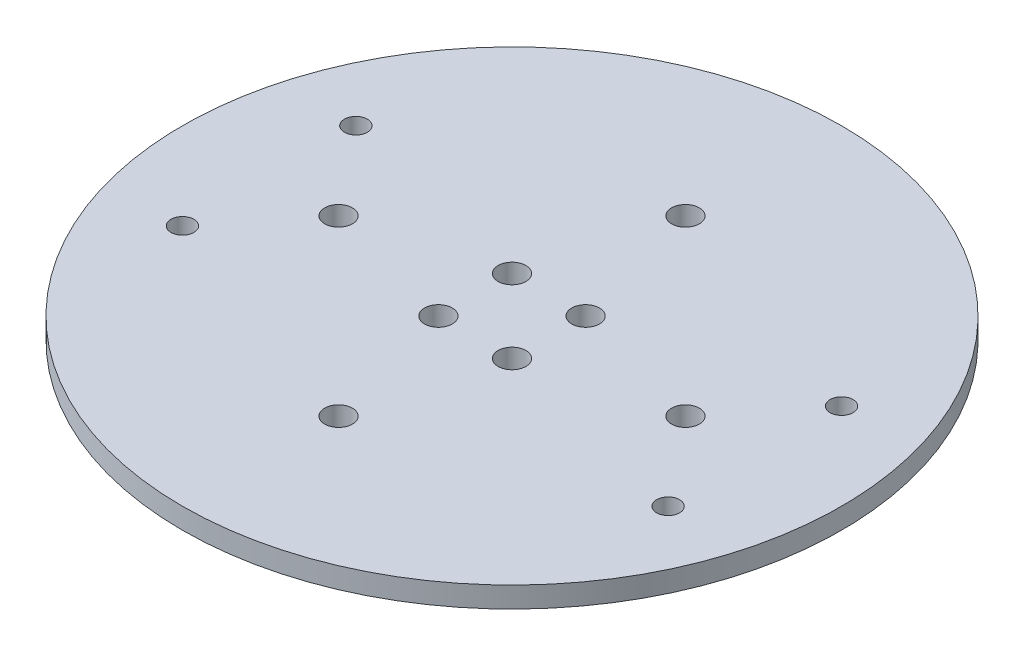
ISO-10303-21;
HEADER;
FILE_DESCRIPTION(('STEP AP214'),'2;1');
FILE_NAME('part.step','',(''),(''),'','','');
FILE_SCHEMA(('AUTOMOTIVE_DESIGN { 1 0 10303 214 1 1 1 1 }'));
ENDSEC;
DATA;
#1=APPLICATION_CONTEXT('core data for automotive mechanical design processes');
#2=APPLICATION_PROTOCOL_DEFINITION('international standard','automotive_design',2000,#1);
#3=PRODUCT_CONTEXT('',#1,'mechanical');
#4=PRODUCT('Part','Part','',(#3));
#5=PRODUCT_RELATED_PRODUCT_CATEGORY('part','',(#4));
#6=PRODUCT_DEFINITION_FORMATION('','',#4);
#7=PRODUCT_DEFINITION_CONTEXT('part definition',#1,'design');
#8=PRODUCT_DEFINITION('design','',#6,#7);
#9=PRODUCT_DEFINITION_SHAPE('','',#8);
#10=(LENGTH_UNIT() NAMED_UNIT(*) SI_UNIT(.MILLI.,.METRE.));
#11=(NAMED_UNIT(*) PLANE_ANGLE_UNIT() SI_UNIT($,.RADIAN.));
#12=(NAMED_UNIT(*) SI_UNIT($,.STERADIAN.) SOLID_ANGLE_UNIT());
#13=UNCERTAINTY_MEASURE_WITH_UNIT(LENGTH_MEASURE(1.E-05),#10,'distance_accuracy_value','');
#14=(GEOMETRIC_REPRESENTATION_CONTEXT(3) GLOBAL_UNCERTAINTY_ASSIGNED_CONTEXT((#13)) GLOBAL_UNIT_ASSIGNED_CONTEXT((#10,
#11,#12)) REPRESENTATION_CONTEXT('',''));
#15=CARTESIAN_POINT('',(0.,0.,0.));
#16=DIRECTION('',(0.,0.,1.));
#17=DIRECTION('',(1.,0.,0.));
#18=AXIS2_PLACEMENT_3D('',#15,#16,#17);
#19=CARTESIAN_POINT('',(0.,3.,0.));
#20=DIRECTION('',(0.,1.,0.));
#21=DIRECTION('',(0.,0.,1.));
#22=AXIS2_PLACEMENT_3D('',#19,#20,#21);
#23=PLANE('',#22);
#24=CARTESIAN_POINT('',(-35.,3.,12.5));
#25=DIRECTION('',(0.,1.,0.));
#26=DIRECTION('',(0.,0.,1.));
#27=AXIS2_PLACEMENT_3D('',#24,#25,#26);
#28=CIRCLE('',#27,1.65);
#29=CARTESIAN_POINT('',(-35.,3.,14.15));
#30=VERTEX_POINT('',#29);
#31=EDGE_CURVE('E101',#30,#30,#28,.T.);
#32=ORIENTED_EDGE('',*,*,#31,.F.);
#33=EDGE_LOOP('',(#32));
#34=FACE_BOUND('',#33,.T.);
#35=CARTESIAN_POINT('',(35.,3.,-12.5));
#36=DIRECTION('',(0.,1.,0.));
#37=DIRECTION('',(0.,0.,1.));
#38=AXIS2_PLACEMENT_3D('',#35,#36,#37);
#39=CIRCLE('',#38,1.65);
#40=CARTESIAN_POINT('',(35.,3.,-10.85));
#41=VERTEX_POINT('',#40);
#42=EDGE_CURVE('E89',#41,#41,#39,.T.);
#43=ORIENTED_EDGE('',*,*,#42,.F.);
#44=EDGE_LOOP('',(#43));
#45=FACE_BOUND('',#44,.T.);
#46=CARTESIAN_POINT('',(-25.,3.,0.));
#47=DIRECTION('',(0.,1.,0.));
#48=DIRECTION('',(0.,0.,1.));
#49=AXIS2_PLACEMENT_3D('',#46,#47,#48);
#50=CIRCLE('',#49,2.00000000000001);
#51=CARTESIAN_POINT('',(-25.,3.,2.00000000000001));
#52=VERTEX_POINT('',#51);
#53=EDGE_CURVE('E77',#52,#52,#50,.T.);
#54=ORIENTED_EDGE('',*,*,#53,.F.);
#55=EDGE_LOOP('',(#54));
#56=FACE_BOUND('',#55,.T.);
#57=CARTESIAN_POINT('',(-5.30330085889905,3.,-5.30330085889916));
#58=DIRECTION('',(0.,1.,0.));
#59=DIRECTION('',(0.,0.,1.));
#60=AXIS2_PLACEMENT_3D('',#57,#58,#59);
#61=CIRCLE('',#60,2.);
#62=CARTESIAN_POINT('',(-5.30330085889905,3.,-3.30330085889916));
#63=VERTEX_POINT('',#62);
#64=EDGE_CURVE('E65',#63,#63,#61,.T.);
#65=ORIENTED_EDGE('',*,*,#64,.F.);
#66=EDGE_LOOP('',(#65));
#67=FACE_BOUND('',#66,.T.);
#68=CARTESIAN_POINT('',(5.30330085889909,3.,5.30330085889913));
#69=DIRECTION('',(0.,1.,0.));
#70=DIRECTION('',(0.,0.,1.));
#71=AXIS2_PLACEMENT_3D('',#68,#69,#70);
#72=CIRCLE('',#71,2.);
#73=CARTESIAN_POINT('',(5.30330085889909,3.,7.30330085889913));
#74=VERTEX_POINT('',#73);
#75=EDGE_CURVE('E53',#74,#74,#72,.T.);
#76=ORIENTED_EDGE('',*,*,#75,.F.);
#77=EDGE_LOOP('',(#76));
#78=FACE_BOUND('',#77,.T.);
#79=CARTESIAN_POINT('',(5.30330085889911,3.,-5.30330085889911));
#80=DIRECTION('',(0.,1.,0.));
#81=DIRECTION('',(0.,0.,1.));
#82=AXIS2_PLACEMENT_3D('',#79,#80,#81);
#83=CIRCLE('',#82,2.);
#84=CARTESIAN_POINT('',(5.30330085889911,3.,-3.30330085889911));
#85=VERTEX_POINT('',#84);
#86=EDGE_CURVE('E42',#85,#85,#83,.T.);
#87=ORIENTED_EDGE('',*,*,#86,.F.);
#88=EDGE_LOOP('',(#87));
#89=FACE_BOUND('',#88,.T.);
#90=CARTESIAN_POINT('',(0.,3.,0.));
#91=DIRECTION('',(0.,1.,0.));
#92=DIRECTION('',(0.,0.,1.));
#93=AXIS2_PLACEMENT_3D('',#90,#91,#92);
#94=CIRCLE('',#93,47.5);
#95=CARTESIAN_POINT('',(0.,3.,47.5));
#96=VERTEX_POINT('',#95);
#97=EDGE_CURVE('E10',#96,#96,#94,.T.);
#98=ORIENTED_EDGE('',*,*,#97,.T.);
#99=EDGE_LOOP('',(#98));
#100=FACE_BOUND('',#99,.T.);
#101=CARTESIAN_POINT('',(25.,3.,0.));
#102=DIRECTION('',(0.,1.,0.));
#103=DIRECTION('',(0.,0.,1.));
#104=AXIS2_PLACEMENT_3D('',#101,#102,#103);
#105=CIRCLE('',#104,2.);
#106=CARTESIAN_POINT('',(25.,3.,2.));
#107=VERTEX_POINT('',#106);
#108=EDGE_CURVE('E47',#107,#107,#105,.T.);
#109=ORIENTED_EDGE('',*,*,#108,.F.);
#110=EDGE_LOOP('',(#109));
#111=FACE_BOUND('',#110,.T.);
#112=CARTESIAN_POINT('',(-5.30330085889914,3.,5.30330085889907));
#113=DIRECTION('',(0.,1.,0.));
#114=DIRECTION('',(0.,0.,1.));
#115=AXIS2_PLACEMENT_3D('',#112,#113,#114);
#116=CIRCLE('',#115,2.);
#117=CARTESIAN_POINT('',(-5.30330085889914,3.,7.30330085889907));
#118=VERTEX_POINT('',#117);
#119=EDGE_CURVE('E59',#118,#118,#116,.T.);
#120=ORIENTED_EDGE('',*,*,#119,.F.);
#121=EDGE_LOOP('',(#120));
#122=FACE_BOUND('',#121,.T.);
#123=CARTESIAN_POINT('',(0.,3.,25.));
#124=DIRECTION('',(0.,1.,0.));
#125=DIRECTION('',(0.,0.,1.));
#126=AXIS2_PLACEMENT_3D('',#123,#124,#125);
#127=CIRCLE('',#126,2.);
#128=CARTESIAN_POINT('',(0.,3.,27.));
#129=VERTEX_POINT('',#128);
#130=EDGE_CURVE('E71',#129,#129,#127,.T.);
#131=ORIENTED_EDGE('',*,*,#130,.F.);
#132=EDGE_LOOP('',(#131));
#133=FACE_BOUND('',#132,.T.);
#134=CARTESIAN_POINT('',(0.,3.,-25.));
#135=DIRECTION('',(0.,1.,0.));
#136=DIRECTION('',(0.,0.,1.));
#137=AXIS2_PLACEMENT_3D('',#134,#135,#136);
#138=CIRCLE('',#137,2.00000000000001);
#139=CARTESIAN_POINT('',(0.,3.,-23.));
#140=VERTEX_POINT('',#139);
#141=EDGE_CURVE('E83',#140,#140,#138,.T.);
#142=ORIENTED_EDGE('',*,*,#141,.F.);
#143=EDGE_LOOP('',(#142));
#144=FACE_BOUND('',#143,.T.);
#145=CARTESIAN_POINT('',(35.,3.,12.5));
#146=DIRECTION('',(0.,1.,0.));
#147=DIRECTION('',(0.,0.,1.));
#148=AXIS2_PLACEMENT_3D('',#145,#146,#147);
#149=CIRCLE('',#148,1.65);
#150=CARTESIAN_POINT('',(35.,3.,14.15));
#151=VERTEX_POINT('',#150);
#152=EDGE_CURVE('E95',#151,#151,#149,.T.);
#153=ORIENTED_EDGE('',*,*,#152,.F.);
#154=EDGE_LOOP('',(#153));
#155=FACE_BOUND('',#154,.T.);
#156=CARTESIAN_POINT('',(-35.,3.,-12.5));
#157=DIRECTION('',(0.,1.,0.));
#158=DIRECTION('',(0.,0.,1.));
#159=AXIS2_PLACEMENT_3D('',#156,#157,#158);
#160=CIRCLE('',#159,1.65);
#161=CARTESIAN_POINT('',(-35.,3.,-10.85));
#162=VERTEX_POINT('',#161);
#163=EDGE_CURVE('E107',#162,#162,#160,.T.);
#164=ORIENTED_EDGE('',*,*,#163,.F.);
#165=EDGE_LOOP('',(#164));
#166=FACE_BOUND('',#165,.T.);
#167=ADVANCED_FACE('F31',(#34,#45,#56,#67,#78,#89,#100,#111,#122,#133,#144,#155,#166),#23,.T.);
#168=CARTESIAN_POINT('',(0.,0.,0.));
#169=DIRECTION('',(0.,1.,0.));
#170=DIRECTION('',(0.,0.,1.));
#171=AXIS2_PLACEMENT_3D('',#168,#169,#170);
#172=PLANE('',#171);
#173=CARTESIAN_POINT('',(0.,0.,0.));
#174=DIRECTION('',(0.,1.,0.));
#175=DIRECTION('',(0.,0.,1.));
#176=AXIS2_PLACEMENT_3D('',#173,#174,#175);
#177=CIRCLE('',#176,47.5);
#178=CARTESIAN_POINT('',(0.,0.,47.5));
#179=VERTEX_POINT('',#178);
#180=EDGE_CURVE('E35',#179,#179,#177,.T.);
#181=ORIENTED_EDGE('',*,*,#180,.F.);
#182=EDGE_LOOP('',(#181));
#183=FACE_BOUND('',#182,.T.);
#184=CARTESIAN_POINT('',(5.30330085889911,0.,-5.30330085889911));
#185=DIRECTION('',(0.,1.,0.));
#186=DIRECTION('',(0.,0.,1.));
#187=AXIS2_PLACEMENT_3D('',#184,#185,#186);
#188=CIRCLE('',#187,2.);
#189=CARTESIAN_POINT('',(5.30330085889911,0.,-3.30330085889911));
#190=VERTEX_POINT('',#189);
#191=EDGE_CURVE('E44',#190,#190,#188,.T.);
#192=ORIENTED_EDGE('',*,*,#191,.T.);
#193=EDGE_LOOP('',(#192));
#194=FACE_BOUND('',#193,.T.);
#195=CARTESIAN_POINT('',(25.,0.,0.));
#196=DIRECTION('',(0.,1.,0.));
#197=DIRECTION('',(0.,0.,1.));
#198=AXIS2_PLACEMENT_3D('',#195,#196,#197);
#199=CIRCLE('',#198,2.);
#200=CARTESIAN_POINT('',(25.,0.,2.));
#201=VERTEX_POINT('',#200);
#202=EDGE_CURVE('E50',#201,#201,#199,.T.);
#203=ORIENTED_EDGE('',*,*,#202,.T.);
#204=EDGE_LOOP('',(#203));
#205=FACE_BOUND('',#204,.T.);
#206=CARTESIAN_POINT('',(5.30330085889909,0.,5.30330085889913));
#207=DIRECTION('',(0.,1.,0.));
#208=DIRECTION('',(0.,0.,1.));
#209=AXIS2_PLACEMENT_3D('',#206,#207,#208);
#210=CIRCLE('',#209,2.);
#211=CARTESIAN_POINT('',(5.30330085889909,0.,7.30330085889913));
#212=VERTEX_POINT('',#211);
#213=EDGE_CURVE('E56',#212,#212,#210,.T.);
#214=ORIENTED_EDGE('',*,*,#213,.T.);
#215=EDGE_LOOP('',(#214));
#216=FACE_BOUND('',#215,.T.);
#217=CARTESIAN_POINT('',(-5.30330085889914,0.,5.30330085889907));
#218=DIRECTION('',(0.,1.,0.));
#219=DIRECTION('',(0.,0.,1.));
#220=AXIS2_PLACEMENT_3D('',#217,#218,#219);
#221=CIRCLE('',#220,2.);
#222=CARTESIAN_POINT('',(-5.30330085889914,0.,7.30330085889907));
#223=VERTEX_POINT('',#222);
#224=EDGE_CURVE('E62',#223,#223,#221,.T.);
#225=ORIENTED_EDGE('',*,*,#224,.T.);
#226=EDGE_LOOP('',(#225));
#227=FACE_BOUND('',#226,.T.);
#228=CARTESIAN_POINT('',(-5.30330085889905,0.,-5.30330085889916));
#229=DIRECTION('',(0.,1.,0.));
#230=DIRECTION('',(0.,0.,1.));
#231=AXIS2_PLACEMENT_3D('',#228,#229,#230);
#232=CIRCLE('',#231,2.);
#233=CARTESIAN_POINT('',(-5.30330085889905,0.,-3.30330085889916));
#234=VERTEX_POINT('',#233);
#235=EDGE_CURVE('E68',#234,#234,#232,.T.);
#236=ORIENTED_EDGE('',*,*,#235,.T.);
#237=EDGE_LOOP('',(#236));
#238=FACE_BOUND('',#237,.T.);
#239=CARTESIAN_POINT('',(0.,0.,25.));
#240=DIRECTION('',(0.,1.,0.));
#241=DIRECTION('',(0.,0.,1.));
#242=AXIS2_PLACEMENT_3D('',#239,#240,#241);
#243=CIRCLE('',#242,2.);
#244=CARTESIAN_POINT('',(0.,0.,27.));
#245=VERTEX_POINT('',#244);
#246=EDGE_CURVE('E74',#245,#245,#243,.T.);
#247=ORIENTED_EDGE('',*,*,#246,.T.);
#248=EDGE_LOOP('',(#247));
#249=FACE_BOUND('',#248,.T.);
#250=CARTESIAN_POINT('',(-25.,0.,0.));
#251=DIRECTION('',(0.,1.,0.));
#252=DIRECTION('',(0.,0.,1.));
#253=AXIS2_PLACEMENT_3D('',#250,#251,#252);
#254=CIRCLE('',#253,2.00000000000001);
#255=CARTESIAN_POINT('',(-25.,0.,2.00000000000001));
#256=VERTEX_POINT('',#255);
#257=EDGE_CURVE('E80',#256,#256,#254,.T.);
#258=ORIENTED_EDGE('',*,*,#257,.T.);
#259=EDGE_LOOP('',(#258));
#260=FACE_BOUND('',#259,.T.);
#261=CARTESIAN_POINT('',(0.,0.,-25.));
#262=DIRECTION('',(0.,1.,0.));
#263=DIRECTION('',(0.,0.,1.));
#264=AXIS2_PLACEMENT_3D('',#261,#262,#263);
#265=CIRCLE('',#264,2.00000000000001);
#266=CARTESIAN_POINT('',(0.,0.,-23.));
#267=VERTEX_POINT('',#266);
#268=EDGE_CURVE('E86',#267,#267,#265,.T.);
#269=ORIENTED_EDGE('',*,*,#268,.T.);
#270=EDGE_LOOP('',(#269));
#271=FACE_BOUND('',#270,.T.);
#272=CARTESIAN_POINT('',(35.,0.,-12.5));
#273=DIRECTION('',(0.,1.,0.));
#274=DIRECTION('',(0.,0.,1.));
#275=AXIS2_PLACEMENT_3D('',#272,#273,#274);
#276=CIRCLE('',#275,1.65);
#277=CARTESIAN_POINT('',(35.,0.,-10.85));
#278=VERTEX_POINT('',#277);
#279=EDGE_CURVE('E92',#278,#278,#276,.T.);
#280=ORIENTED_EDGE('',*,*,#279,.T.);
#281=EDGE_LOOP('',(#280));
#282=FACE_BOUND('',#281,.T.);
#283=CARTESIAN_POINT('',(35.,0.,12.5));
#284=DIRECTION('',(0.,1.,0.));
#285=DIRECTION('',(0.,0.,1.));
#286=AXIS2_PLACEMENT_3D('',#283,#284,#285);
#287=CIRCLE('',#286,1.65);
#288=CARTESIAN_POINT('',(35.,0.,14.15));
#289=VERTEX_POINT('',#288);
#290=EDGE_CURVE('E98',#289,#289,#287,.T.);
#291=ORIENTED_EDGE('',*,*,#290,.T.);
#292=EDGE_LOOP('',(#291));
#293=FACE_BOUND('',#292,.T.);
#294=CARTESIAN_POINT('',(-35.,0.,12.5));
#295=DIRECTION('',(0.,1.,0.));
#296=DIRECTION('',(0.,0.,1.));
#297=AXIS2_PLACEMENT_3D('',#294,#295,#296);
#298=CIRCLE('',#297,1.65);
#299=CARTESIAN_POINT('',(-35.,0.,14.15));
#300=VERTEX_POINT('',#299);
#301=EDGE_CURVE('E104',#300,#300,#298,.T.);
#302=ORIENTED_EDGE('',*,*,#301,.T.);
#303=EDGE_LOOP('',(#302));
#304=FACE_BOUND('',#303,.T.);
#305=CARTESIAN_POINT('',(-35.,0.,-12.5));
#306=DIRECTION('',(0.,1.,0.));
#307=DIRECTION('',(0.,0.,1.));
#308=AXIS2_PLACEMENT_3D('',#305,#306,#307);
#309=CIRCLE('',#308,1.65);
#310=CARTESIAN_POINT('',(-35.,0.,-10.85));
#311=VERTEX_POINT('',#310);
#312=EDGE_CURVE('E110',#311,#311,#309,.T.);
#313=ORIENTED_EDGE('',*,*,#312,.T.);
#314=EDGE_LOOP('',(#313));
#315=FACE_BOUND('',#314,.T.);
#316=ADVANCED_FACE('F120',(#183,#194,#205,#216,#227,#238,#249,#260,#271,#282,#293,#304,#315),
#172,.F.);
#317=CARTESIAN_POINT('',(0.,3.,0.));
#318=DIRECTION('',(0.,-1.,0.));
#319=DIRECTION('',(0.,0.,-1.));
#320=AXIS2_PLACEMENT_3D('',#317,#318,#319);
#321=CYLINDRICAL_SURFACE('',#320,47.5);
#322=ORIENTED_EDGE('',*,*,#97,.F.);
#323=EDGE_LOOP('',(#322));
#324=FACE_BOUND('',#323,.T.);
#325=ORIENTED_EDGE('',*,*,#180,.T.);
#326=EDGE_LOOP('',(#325));
#327=FACE_BOUND('',#326,.T.);
#328=ADVANCED_FACE('F33',(#324,#327),#321,.T.);
#329=CARTESIAN_POINT('',(5.30330085889911,3.,-5.30330085889911));
#330=DIRECTION('',(0.,-1.,0.));
#331=DIRECTION('',(0.,0.,-1.));
#332=AXIS2_PLACEMENT_3D('',#329,#330,#331);
#333=CYLINDRICAL_SURFACE('',#332,2.);
#334=ORIENTED_EDGE('',*,*,#86,.T.);
#335=EDGE_LOOP('',(#334));
#336=FACE_BOUND('',#335,.T.);
#337=ORIENTED_EDGE('',*,*,#191,.F.);
#338=EDGE_LOOP('',(#337));
#339=FACE_BOUND('',#338,.T.);
#340=ADVANCED_FACE('F130',(#336,#339),#333,.F.);
#341=CARTESIAN_POINT('',(25.,3.,0.));
#342=DIRECTION('',(0.,-1.,0.));
#343=DIRECTION('',(0.,0.,-1.));
#344=AXIS2_PLACEMENT_3D('',#341,#342,#343);
#345=CYLINDRICAL_SURFACE('',#344,2.);
#346=ORIENTED_EDGE('',*,*,#108,.T.);
#347=EDGE_LOOP('',(#346));
#348=FACE_BOUND('',#347,.T.);
#349=ORIENTED_EDGE('',*,*,#202,.F.);
#350=EDGE_LOOP('',(#349));
#351=FACE_BOUND('',#350,.T.);
#352=ADVANCED_FACE('F133',(#348,#351),#345,.F.);
#353=CARTESIAN_POINT('',(5.30330085889909,3.,5.30330085889913));
#354=DIRECTION('',(0.,-1.,0.));
#355=DIRECTION('',(0.,0.,-1.));
#356=AXIS2_PLACEMENT_3D('',#353,#354,#355);
#357=CYLINDRICAL_SURFACE('',#356,2.);
#358=ORIENTED_EDGE('',*,*,#75,.T.);
#359=EDGE_LOOP('',(#358));
#360=FACE_BOUND('',#359,.T.);
#361=ORIENTED_EDGE('',*,*,#213,.F.);
#362=EDGE_LOOP('',(#361));
#363=FACE_BOUND('',#362,.T.);
#364=ADVANCED_FACE('F137',(#360,#363),#357,.F.);
#365=CARTESIAN_POINT('',(-5.30330085889914,3.,5.30330085889907));
#366=DIRECTION('',(0.,-1.,0.));
#367=DIRECTION('',(0.,0.,-1.));
#368=AXIS2_PLACEMENT_3D('',#365,#366,#367);
#369=CYLINDRICAL_SURFACE('',#368,2.);
#370=ORIENTED_EDGE('',*,*,#119,.T.);
#371=EDGE_LOOP('',(#370));
#372=FACE_BOUND('',#371,.T.);
#373=ORIENTED_EDGE('',*,*,#224,.F.);
#374=EDGE_LOOP('',(#373));
#375=FACE_BOUND('',#374,.T.);
#376=ADVANCED_FACE('F141',(#372,#375),#369,.F.);
#377=CARTESIAN_POINT('',(-5.30330085889905,3.,-5.30330085889916));
#378=DIRECTION('',(0.,-1.,0.));
#379=DIRECTION('',(0.,0.,-1.));
#380=AXIS2_PLACEMENT_3D('',#377,#378,#379);
#381=CYLINDRICAL_SURFACE('',#380,2.);
#382=ORIENTED_EDGE('',*,*,#64,.T.);
#383=EDGE_LOOP('',(#382));
#384=FACE_BOUND('',#383,.T.);
#385=ORIENTED_EDGE('',*,*,#235,.F.);
#386=EDGE_LOOP('',(#385));
#387=FACE_BOUND('',#386,.T.);
#388=ADVANCED_FACE('F145',(#384,#387),#381,.F.);
#389=CARTESIAN_POINT('',(0.,3.,25.));
#390=DIRECTION('',(0.,-1.,0.));
#391=DIRECTION('',(0.,0.,-1.));
#392=AXIS2_PLACEMENT_3D('',#389,#390,#391);
#393=CYLINDRICAL_SURFACE('',#392,2.);
#394=ORIENTED_EDGE('',*,*,#130,.T.);
#395=EDGE_LOOP('',(#394));
#396=FACE_BOUND('',#395,.T.);
#397=ORIENTED_EDGE('',*,*,#246,.F.);
#398=EDGE_LOOP('',(#397));
#399=FACE_BOUND('',#398,.T.);
#400=ADVANCED_FACE('F149',(#396,#399),#393,.F.);
#401=CARTESIAN_POINT('',(-25.,3.,0.));
#402=DIRECTION('',(0.,-1.,0.));
#403=DIRECTION('',(0.,0.,-1.));
#404=AXIS2_PLACEMENT_3D('',#401,#402,#403);
#405=CYLINDRICAL_SURFACE('',#404,2.00000000000001);
#406=ORIENTED_EDGE('',*,*,#53,.T.);
#407=EDGE_LOOP('',(#406));
#408=FACE_BOUND('',#407,.T.);
#409=ORIENTED_EDGE('',*,*,#257,.F.);
#410=EDGE_LOOP('',(#409));
#411=FACE_BOUND('',#410,.T.);
#412=ADVANCED_FACE('F153',(#408,#411),#405,.F.);
#413=CARTESIAN_POINT('',(0.,3.,-25.));
#414=DIRECTION('',(0.,-1.,0.));
#415=DIRECTION('',(0.,0.,-1.));
#416=AXIS2_PLACEMENT_3D('',#413,#414,#415);
#417=CYLINDRICAL_SURFACE('',#416,2.00000000000001);
#418=ORIENTED_EDGE('',*,*,#141,.T.);
#419=EDGE_LOOP('',(#418));
#420=FACE_BOUND('',#419,.T.);
#421=ORIENTED_EDGE('',*,*,#268,.F.);
#422=EDGE_LOOP('',(#421));
#423=FACE_BOUND('',#422,.T.);
#424=ADVANCED_FACE('F157',(#420,#423),#417,.F.);
#425=CARTESIAN_POINT('',(35.,3.,-12.5));
#426=DIRECTION('',(0.,-1.,0.));
#427=DIRECTION('',(0.,0.,-1.));
#428=AXIS2_PLACEMENT_3D('',#425,#426,#427);
#429=CYLINDRICAL_SURFACE('',#428,1.65);
#430=ORIENTED_EDGE('',*,*,#42,.T.);
#431=EDGE_LOOP('',(#430));
#432=FACE_BOUND('',#431,.T.);
#433=ORIENTED_EDGE('',*,*,#279,.F.);
#434=EDGE_LOOP('',(#433));
#435=FACE_BOUND('',#434,.T.);
#436=ADVANCED_FACE('F161',(#432,#435),#429,.F.);
#437=CARTESIAN_POINT('',(35.,3.,12.5));
#438=DIRECTION('',(0.,-1.,0.));
#439=DIRECTION('',(0.,0.,-1.));
#440=AXIS2_PLACEMENT_3D('',#437,#438,#439);
#441=CYLINDRICAL_SURFACE('',#440,1.65);
#442=ORIENTED_EDGE('',*,*,#152,.T.);
#443=EDGE_LOOP('',(#442));
#444=FACE_BOUND('',#443,.T.);
#445=ORIENTED_EDGE('',*,*,#290,.F.);
#446=EDGE_LOOP('',(#445));
#447=FACE_BOUND('',#446,.T.);
#448=ADVANCED_FACE('F165',(#444,#447),#441,.F.);
#449=CARTESIAN_POINT('',(-35.,3.,12.5));
#450=DIRECTION('',(0.,-1.,0.));
#451=DIRECTION('',(0.,0.,-1.));
#452=AXIS2_PLACEMENT_3D('',#449,#450,#451);
#453=CYLINDRICAL_SURFACE('',#452,1.65);
#454=ORIENTED_EDGE('',*,*,#31,.T.);
#455=EDGE_LOOP('',(#454));
#456=FACE_BOUND('',#455,.T.);
#457=ORIENTED_EDGE('',*,*,#301,.F.);
#458=EDGE_LOOP('',(#457));
#459=FACE_BOUND('',#458,.T.);
#460=ADVANCED_FACE('F169',(#456,#459),#453,.F.);
#461=CARTESIAN_POINT('',(-35.,3.,-12.5));
#462=DIRECTION('',(0.,-1.,0.));
#463=DIRECTION('',(0.,0.,-1.));
#464=AXIS2_PLACEMENT_3D('',#461,#462,#463);
#465=CYLINDRICAL_SURFACE('',#464,1.65);
#466=ORIENTED_EDGE('',*,*,#163,.T.);
#467=EDGE_LOOP('',(#466));
#468=FACE_BOUND('',#467,.T.);
#469=ORIENTED_EDGE('',*,*,#312,.F.);
#470=EDGE_LOOP('',(#469));
#471=FACE_BOUND('',#470,.T.);
#472=ADVANCED_FACE('F116',(#468,#471),#465,.F.);
#473=CLOSED_SHELL('',(#167,#316,#328,#340,#352,#364,#376,#388,#400,#412,#424,#436,#448,#460,#472));
#474=MANIFOLD_SOLID_BREP('B2',#473);
#475=ADVANCED_BREP_SHAPE_REPRESENTATION('',(#18,#474),#14);
#476=SHAPE_DEFINITION_REPRESENTATION(#9,#475);
ENDSEC;
END-ISO-10303-21;
